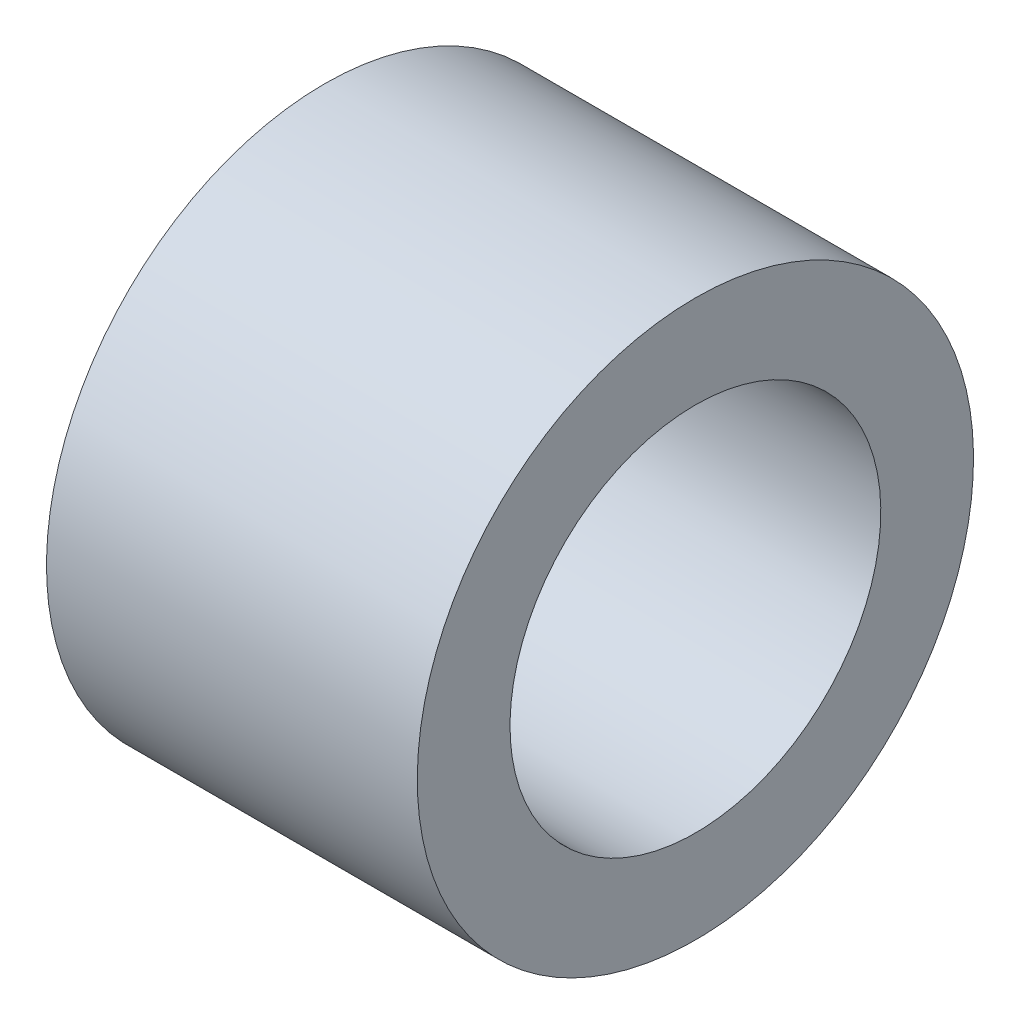
ISO-10303-21;
HEADER;
FILE_DESCRIPTION(('STEP AP214'),'2;1');
FILE_NAME('part.step','',(''),(''),'','','');
FILE_SCHEMA(('AUTOMOTIVE_DESIGN { 1 0 10303 214 1 1 1 1 }'));
ENDSEC;
DATA;
#1=APPLICATION_CONTEXT('core data for automotive mechanical design processes');
#2=APPLICATION_PROTOCOL_DEFINITION('international standard','automotive_design',2000,#1);
#3=PRODUCT_CONTEXT('',#1,'mechanical');
#4=PRODUCT('Part','Part','',(#3));
#5=PRODUCT_RELATED_PRODUCT_CATEGORY('part','',(#4));
#6=PRODUCT_DEFINITION_FORMATION('','',#4);
#7=PRODUCT_DEFINITION_CONTEXT('part definition',#1,'design');
#8=PRODUCT_DEFINITION('design','',#6,#7);
#9=PRODUCT_DEFINITION_SHAPE('','',#8);
#10=(LENGTH_UNIT() NAMED_UNIT(*) SI_UNIT(.MILLI.,.METRE.));
#11=(NAMED_UNIT(*) PLANE_ANGLE_UNIT() SI_UNIT($,.RADIAN.));
#12=(NAMED_UNIT(*) SI_UNIT($,.STERADIAN.) SOLID_ANGLE_UNIT());
#13=UNCERTAINTY_MEASURE_WITH_UNIT(LENGTH_MEASURE(1.E-05),#10,'distance_accuracy_value','');
#14=(GEOMETRIC_REPRESENTATION_CONTEXT(3) GLOBAL_UNCERTAINTY_ASSIGNED_CONTEXT((#13)) GLOBAL_UNIT_ASSIGNED_CONTEXT((#10,
#11,#12)) REPRESENTATION_CONTEXT('',''));
#15=CARTESIAN_POINT('',(0.,0.,0.));
#16=DIRECTION('',(0.,0.,1.));
#17=DIRECTION('',(1.,0.,0.));
#18=AXIS2_PLACEMENT_3D('',#15,#16,#17);
#19=CARTESIAN_POINT('',(0.,0.,0.));
#20=DIRECTION('',(-1.,0.,0.));
#21=DIRECTION('',(0.,-1.,0.));
#22=AXIS2_PLACEMENT_3D('',#19,#20,#21);
#23=PLANE('',#22);
#24=CARTESIAN_POINT('',(0.,0.,0.));
#25=DIRECTION('',(1.,0.,0.));
#26=DIRECTION('',(0.,1.,0.));
#27=AXIS2_PLACEMENT_3D('',#24,#25,#26);
#28=CIRCLE('',#27,6.);
#29=CARTESIAN_POINT('',(0.,6.,0.));
#30=VERTEX_POINT('',#29);
#31=EDGE_CURVE('E10',#30,#30,#28,.T.);
#32=ORIENTED_EDGE('',*,*,#31,.F.);
#33=EDGE_LOOP('',(#32));
#34=FACE_BOUND('',#33,.T.);
#35=ADVANCED_FACE('F43',(#34),#23,.T.);
#36=CARTESIAN_POINT('',(1.,0.,0.));
#37=DIRECTION('',(1.,0.,0.));
#38=DIRECTION('',(0.,1.,0.));
#39=AXIS2_PLACEMENT_3D('',#36,#37,#38);
#40=CYLINDRICAL_SURFACE('',#39,6.);
#41=ORIENTED_EDGE('',*,*,#31,.T.);
#42=EDGE_LOOP('',(#41));
#43=FACE_BOUND('',#42,.T.);
#44=CARTESIAN_POINT('',(8.,0.,0.));
#45=DIRECTION('',(1.,0.,0.));
#46=DIRECTION('',(0.,1.,0.));
#47=AXIS2_PLACEMENT_3D('',#44,#45,#46);
#48=CIRCLE('',#47,6.);
#49=CARTESIAN_POINT('',(8.,6.,0.));
#50=VERTEX_POINT('',#49);
#51=EDGE_CURVE('E50',#50,#50,#48,.T.);
#52=ORIENTED_EDGE('',*,*,#51,.F.);
#53=EDGE_LOOP('',(#52));
#54=FACE_BOUND('',#53,.T.);
#55=ADVANCED_FACE('F79',(#43,#54),#40,.T.);
#56=CARTESIAN_POINT('',(8.,6.,0.));
#57=DIRECTION('',(1.,0.,0.));
#58=DIRECTION('',(0.,1.,0.));
#59=AXIS2_PLACEMENT_3D('',#56,#57,#58);
#60=PLANE('',#59);
#61=ORIENTED_EDGE('',*,*,#51,.T.);
#62=EDGE_LOOP('',(#61));
#63=FACE_BOUND('',#62,.T.);
#64=CARTESIAN_POINT('',(8.,0.,0.));
#65=DIRECTION('',(1.,0.,0.));
#66=DIRECTION('',(0.,1.,0.));
#67=AXIS2_PLACEMENT_3D('',#64,#65,#66);
#68=CIRCLE('',#67,4.);
#69=CARTESIAN_POINT('',(8.,4.,0.));
#70=VERTEX_POINT('',#69);
#71=EDGE_CURVE('E55',#70,#70,#68,.T.);
#72=ORIENTED_EDGE('',*,*,#71,.F.);
#73=EDGE_LOOP('',(#72));
#74=FACE_BOUND('',#73,.T.);
#75=ADVANCED_FACE('F71',(#63,#74),#60,.T.);
#76=CARTESIAN_POINT('',(1.,0.,0.));
#77=DIRECTION('',(1.,0.,0.));
#78=DIRECTION('',(0.,1.,0.));
#79=AXIS2_PLACEMENT_3D('',#76,#77,#78);
#80=CYLINDRICAL_SURFACE('',#79,4.);
#81=ORIENTED_EDGE('',*,*,#71,.T.);
#82=EDGE_LOOP('',(#81));
#83=FACE_BOUND('',#82,.T.);
#84=CARTESIAN_POINT('',(1.,0.,0.));
#85=DIRECTION('',(1.,0.,0.));
#86=DIRECTION('',(0.,1.,0.));
#87=AXIS2_PLACEMENT_3D('',#84,#85,#86);
#88=CIRCLE('',#87,4.);
#89=CARTESIAN_POINT('',(1.,4.,0.));
#90=VERTEX_POINT('',#89);
#91=EDGE_CURVE('E60',#90,#90,#88,.T.);
#92=ORIENTED_EDGE('',*,*,#91,.F.);
#93=EDGE_LOOP('',(#92));
#94=FACE_BOUND('',#93,.T.);
#95=ADVANCED_FACE('F69',(#83,#94),#80,.F.);
#96=CARTESIAN_POINT('',(1.,4.,0.));
#97=DIRECTION('',(1.,0.,0.));
#98=DIRECTION('',(0.,1.,0.));
#99=AXIS2_PLACEMENT_3D('',#96,#97,#98);
#100=PLANE('',#99);
#101=ORIENTED_EDGE('',*,*,#91,.T.);
#102=EDGE_LOOP('',(#101));
#103=FACE_BOUND('',#102,.T.);
#104=ADVANCED_FACE('F67',(#103),#100,.T.);
#105=CLOSED_SHELL('',(#35,#55,#75,#95,#104));
#106=MANIFOLD_SOLID_BREP('B2',#105);
#107=ADVANCED_BREP_SHAPE_REPRESENTATION('',(#18,#106),#14);
#108=SHAPE_DEFINITION_REPRESENTATION(#9,#107);
ENDSEC;
END-ISO-10303-21;
